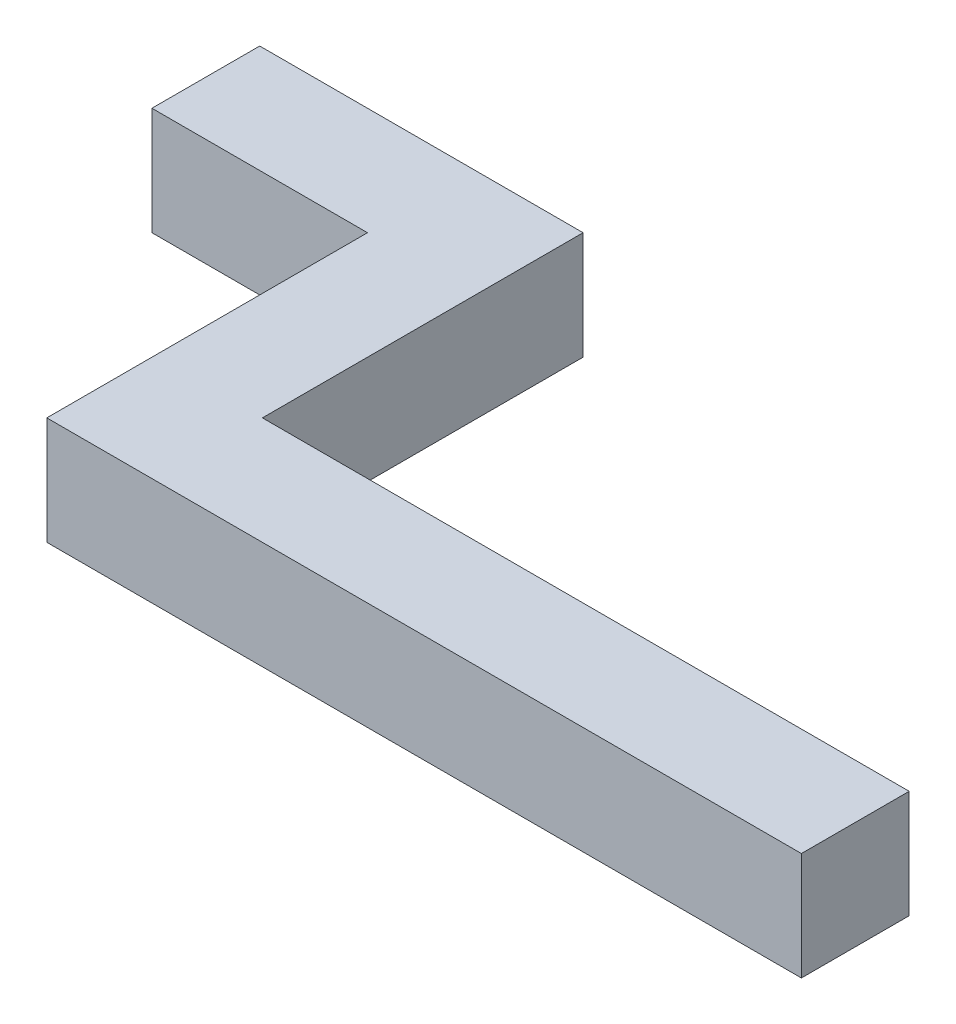
ISO-10303-21;
HEADER;
FILE_DESCRIPTION(('STEP AP214'),'2;1');
FILE_NAME('part.step','',(''),(''),'','','');
FILE_SCHEMA(('AUTOMOTIVE_DESIGN { 1 0 10303 214 1 1 1 1 }'));
ENDSEC;
DATA;
#1=APPLICATION_CONTEXT('core data for automotive mechanical design processes');
#2=APPLICATION_PROTOCOL_DEFINITION('international standard','automotive_design',2000,#1);
#3=PRODUCT_CONTEXT('',#1,'mechanical');
#4=PRODUCT('Part','Part','',(#3));
#5=PRODUCT_RELATED_PRODUCT_CATEGORY('part','',(#4));
#6=PRODUCT_DEFINITION_FORMATION('','',#4);
#7=PRODUCT_DEFINITION_CONTEXT('part definition',#1,'design');
#8=PRODUCT_DEFINITION('design','',#6,#7);
#9=PRODUCT_DEFINITION_SHAPE('','',#8);
#10=(LENGTH_UNIT() NAMED_UNIT(*) SI_UNIT(.MILLI.,.METRE.));
#11=(NAMED_UNIT(*) PLANE_ANGLE_UNIT() SI_UNIT($,.RADIAN.));
#12=(NAMED_UNIT(*) SI_UNIT($,.STERADIAN.) SOLID_ANGLE_UNIT());
#13=UNCERTAINTY_MEASURE_WITH_UNIT(LENGTH_MEASURE(1.E-05),#10,'distance_accuracy_value','');
#14=(GEOMETRIC_REPRESENTATION_CONTEXT(3) GLOBAL_UNCERTAINTY_ASSIGNED_CONTEXT((#13)) GLOBAL_UNIT_ASSIGNED_CONTEXT((#10,
#11,#12)) REPRESENTATION_CONTEXT('',''));
#15=CARTESIAN_POINT('',(0.,0.,0.));
#16=DIRECTION('',(0.,0.,1.));
#17=DIRECTION('',(1.,0.,0.));
#18=AXIS2_PLACEMENT_3D('',#15,#16,#17);
#19=CARTESIAN_POINT('',(0.,20.,0.));
#20=DIRECTION('',(1.,0.,0.));
#21=DIRECTION('',(0.,0.,-1.));
#22=AXIS2_PLACEMENT_3D('',#19,#20,#21);
#23=PLANE('',#22);
#24=DIRECTION('',(0.,0.,1.));
#25=VECTOR('',#24,1.);
#26=CARTESIAN_POINT('',(0.,0.,0.));
#27=LINE('',#26,#25);
#28=CARTESIAN_POINT('',(0.,0.,0.));
#29=VERTEX_POINT('',#28);
#30=CARTESIAN_POINT('',(0.,0.,20.));
#31=VERTEX_POINT('',#30);
#32=EDGE_CURVE('E140',#29,#31,#27,.T.);
#33=ORIENTED_EDGE('',*,*,#32,.T.);
#34=DIRECTION('',(0.,-1.,0.));
#35=VECTOR('',#34,1.);
#36=CARTESIAN_POINT('',(0.,20.,20.));
#37=LINE('',#36,#35);
#38=CARTESIAN_POINT('',(0.,20.,20.));
#39=VERTEX_POINT('',#38);
#40=EDGE_CURVE('E11',#39,#31,#37,.T.);
#41=ORIENTED_EDGE('',*,*,#40,.F.);
#42=DIRECTION('',(0.,0.,1.));
#43=VECTOR('',#42,1.);
#44=CARTESIAN_POINT('',(0.,20.,0.));
#45=LINE('',#44,#43);
#46=CARTESIAN_POINT('',(0.,20.,0.));
#47=VERTEX_POINT('',#46);
#48=EDGE_CURVE('E163',#47,#39,#45,.T.);
#49=ORIENTED_EDGE('',*,*,#48,.F.);
#50=DIRECTION('',(0.,-1.,0.));
#51=VECTOR('',#50,1.);
#52=CARTESIAN_POINT('',(0.,20.,0.));
#53=LINE('',#52,#51);
#54=EDGE_CURVE('E136',#47,#29,#53,.T.);
#55=ORIENTED_EDGE('',*,*,#54,.T.);
#56=EDGE_LOOP('',(#33,#41,#49,#55));
#57=FACE_BOUND('',#56,.T.);
#58=ADVANCED_FACE('F39',(#57),#23,.F.);
#59=CARTESIAN_POINT('',(0.,20.,20.));
#60=DIRECTION('',(0.,0.,-1.));
#61=DIRECTION('',(-1.,0.,0.));
#62=AXIS2_PLACEMENT_3D('',#59,#60,#61);
#63=PLANE('',#62);
#64=DIRECTION('',(1.,0.,0.));
#65=VECTOR('',#64,1.);
#66=CARTESIAN_POINT('',(0.,0.,20.));
#67=LINE('',#66,#65);
#68=CARTESIAN_POINT('',(40.,0.,20.));
#69=VERTEX_POINT('',#68);
#70=EDGE_CURVE('E144',#31,#69,#67,.T.);
#71=ORIENTED_EDGE('',*,*,#70,.T.);
#72=DIRECTION('',(0.,-1.,0.));
#73=VECTOR('',#72,1.);
#74=CARTESIAN_POINT('',(40.,20.,20.));
#75=LINE('',#74,#73);
#76=CARTESIAN_POINT('',(40.,20.,20.));
#77=VERTEX_POINT('',#76);
#78=EDGE_CURVE('E48',#77,#69,#75,.T.);
#79=ORIENTED_EDGE('',*,*,#78,.F.);
#80=DIRECTION('',(1.,0.,0.));
#81=VECTOR('',#80,1.);
#82=CARTESIAN_POINT('',(0.,20.,20.));
#83=LINE('',#82,#81);
#84=EDGE_CURVE('E99',#39,#77,#83,.T.);
#85=ORIENTED_EDGE('',*,*,#84,.F.);
#86=ORIENTED_EDGE('',*,*,#40,.T.);
#87=EDGE_LOOP('',(#71,#79,#85,#86));
#88=FACE_BOUND('',#87,.T.);
#89=ADVANCED_FACE('F208',(#88),#63,.F.);
#90=CARTESIAN_POINT('',(40.,20.,20.));
#91=DIRECTION('',(1.,0.,0.));
#92=DIRECTION('',(0.,0.,-1.));
#93=AXIS2_PLACEMENT_3D('',#90,#91,#92);
#94=PLANE('',#93);
#95=DIRECTION('',(0.,0.,1.));
#96=VECTOR('',#95,1.);
#97=CARTESIAN_POINT('',(40.,0.,20.));
#98=LINE('',#97,#96);
#99=CARTESIAN_POINT('',(40.,0.,79.5));
#100=VERTEX_POINT('',#99);
#101=EDGE_CURVE('E147',#69,#100,#98,.T.);
#102=ORIENTED_EDGE('',*,*,#101,.T.);
#103=DIRECTION('',(0.,-1.,0.));
#104=VECTOR('',#103,1.);
#105=CARTESIAN_POINT('',(40.,20.,79.5));
#106=LINE('',#105,#104);
#107=CARTESIAN_POINT('',(40.,20.,79.5));
#108=VERTEX_POINT('',#107);
#109=EDGE_CURVE('E174',#108,#100,#106,.T.);
#110=ORIENTED_EDGE('',*,*,#109,.F.);
#111=DIRECTION('',(0.,0.,1.));
#112=VECTOR('',#111,1.);
#113=CARTESIAN_POINT('',(40.,20.,20.));
#114=LINE('',#113,#112);
#115=EDGE_CURVE('E184',#77,#108,#114,.T.);
#116=ORIENTED_EDGE('',*,*,#115,.F.);
#117=ORIENTED_EDGE('',*,*,#78,.T.);
#118=EDGE_LOOP('',(#102,#110,#116,#117));
#119=FACE_BOUND('',#118,.T.);
#120=ADVANCED_FACE('F182',(#119),#94,.F.);
#121=CARTESIAN_POINT('',(126.937455237789,20.,79.5));
#122=DIRECTION('',(0.,0.,-1.));
#123=DIRECTION('',(-1.,0.,0.));
#124=AXIS2_PLACEMENT_3D('',#121,#122,#123);
#125=PLANE('',#124);
#126=DIRECTION('',(1.,0.,0.));
#127=VECTOR('',#126,1.);
#128=CARTESIAN_POINT('',(126.937455237789,0.,79.5));
#129=LINE('',#128,#127);
#130=CARTESIAN_POINT('',(180.,0.,79.5));
#131=VERTEX_POINT('',#130);
#132=EDGE_CURVE('E151',#100,#131,#129,.T.);
#133=ORIENTED_EDGE('',*,*,#132,.T.);
#134=DIRECTION('',(0.,-1.,0.));
#135=VECTOR('',#134,1.);
#136=CARTESIAN_POINT('',(180.,20.,79.5));
#137=LINE('',#136,#135);
#138=CARTESIAN_POINT('',(180.,20.,79.5));
#139=VERTEX_POINT('',#138);
#140=EDGE_CURVE('E170',#139,#131,#137,.T.);
#141=ORIENTED_EDGE('',*,*,#140,.F.);
#142=DIRECTION('',(1.,0.,0.));
#143=VECTOR('',#142,1.);
#144=CARTESIAN_POINT('',(40.,20.,79.5));
#145=LINE('',#144,#143);
#146=EDGE_CURVE('E196',#108,#139,#145,.T.);
#147=ORIENTED_EDGE('',*,*,#146,.F.);
#148=ORIENTED_EDGE('',*,*,#109,.T.);
#149=EDGE_LOOP('',(#133,#141,#147,#148));
#150=FACE_BOUND('',#149,.T.);
#151=ADVANCED_FACE('F191',(#150),#125,.F.);
#152=CARTESIAN_POINT('',(180.,20.,79.5));
#153=DIRECTION('',(-1.,0.,0.));
#154=DIRECTION('',(0.,0.,1.));
#155=AXIS2_PLACEMENT_3D('',#152,#153,#154);
#156=PLANE('',#155);
#157=DIRECTION('',(0.,0.,-1.));
#158=VECTOR('',#157,1.);
#159=CARTESIAN_POINT('',(180.,0.,79.5));
#160=LINE('',#159,#158);
#161=CARTESIAN_POINT('',(180.,0.,59.5));
#162=VERTEX_POINT('',#161);
#163=EDGE_CURVE('E154',#131,#162,#160,.T.);
#164=ORIENTED_EDGE('',*,*,#163,.T.);
#165=DIRECTION('',(0.,-1.,0.));
#166=VECTOR('',#165,1.);
#167=CARTESIAN_POINT('',(180.,20.,59.5));
#168=LINE('',#167,#166);
#169=CARTESIAN_POINT('',(180.,20.,59.5));
#170=VERTEX_POINT('',#169);
#171=EDGE_CURVE('E129',#170,#162,#168,.T.);
#172=ORIENTED_EDGE('',*,*,#171,.F.);
#173=DIRECTION('',(0.,0.,-1.));
#174=VECTOR('',#173,1.);
#175=CARTESIAN_POINT('',(180.,20.,79.5));
#176=LINE('',#175,#174);
#177=EDGE_CURVE('E118',#139,#170,#176,.T.);
#178=ORIENTED_EDGE('',*,*,#177,.F.);
#179=ORIENTED_EDGE('',*,*,#140,.T.);
#180=EDGE_LOOP('',(#164,#172,#178,#179));
#181=FACE_BOUND('',#180,.T.);
#182=ADVANCED_FACE('F194',(#181),#156,.F.);
#183=CARTESIAN_POINT('',(60.,20.,59.5));
#184=DIRECTION('',(0.,0.,1.));
#185=DIRECTION('',(1.,0.,0.));
#186=AXIS2_PLACEMENT_3D('',#183,#184,#185);
#187=PLANE('',#186);
#188=DIRECTION('',(-1.,0.,0.));
#189=VECTOR('',#188,1.);
#190=CARTESIAN_POINT('',(60.,0.,59.5));
#191=LINE('',#190,#189);
#192=CARTESIAN_POINT('',(60.,0.,59.5));
#193=VERTEX_POINT('',#192);
#194=EDGE_CURVE('E127',#162,#193,#191,.T.);
#195=ORIENTED_EDGE('',*,*,#194,.T.);
#196=DIRECTION('',(0.,-1.,0.));
#197=VECTOR('',#196,1.);
#198=CARTESIAN_POINT('',(60.,20.,59.5));
#199=LINE('',#198,#197);
#200=CARTESIAN_POINT('',(60.,20.,59.5));
#201=VERTEX_POINT('',#200);
#202=EDGE_CURVE('E124',#201,#193,#199,.T.);
#203=ORIENTED_EDGE('',*,*,#202,.F.);
#204=DIRECTION('',(-1.,0.,0.));
#205=VECTOR('',#204,1.);
#206=CARTESIAN_POINT('',(60.,20.,59.5));
#207=LINE('',#206,#205);
#208=EDGE_CURVE('E112',#170,#201,#207,.T.);
#209=ORIENTED_EDGE('',*,*,#208,.F.);
#210=ORIENTED_EDGE('',*,*,#171,.T.);
#211=EDGE_LOOP('',(#195,#203,#209,#210));
#212=FACE_BOUND('',#211,.T.);
#213=ADVANCED_FACE('F125',(#212),#187,.F.);
#214=CARTESIAN_POINT('',(60.,20.,0.));
#215=DIRECTION('',(-1.,0.,0.));
#216=DIRECTION('',(0.,0.,1.));
#217=AXIS2_PLACEMENT_3D('',#214,#215,#216);
#218=PLANE('',#217);
#219=DIRECTION('',(0.,0.,-1.));
#220=VECTOR('',#219,1.);
#221=CARTESIAN_POINT('',(60.,0.,0.));
#222=LINE('',#221,#220);
#223=CARTESIAN_POINT('',(60.,0.,0.));
#224=VERTEX_POINT('',#223);
#225=EDGE_CURVE('E85',#193,#224,#222,.T.);
#226=ORIENTED_EDGE('',*,*,#225,.T.);
#227=DIRECTION('',(0.,-1.,0.));
#228=VECTOR('',#227,1.);
#229=CARTESIAN_POINT('',(60.,20.,0.));
#230=LINE('',#229,#228);
#231=CARTESIAN_POINT('',(60.,20.,0.));
#232=VERTEX_POINT('',#231);
#233=EDGE_CURVE('E130',#232,#224,#230,.T.);
#234=ORIENTED_EDGE('',*,*,#233,.F.);
#235=DIRECTION('',(0.,0.,-1.));
#236=VECTOR('',#235,1.);
#237=CARTESIAN_POINT('',(60.,20.,0.));
#238=LINE('',#237,#236);
#239=EDGE_CURVE('E116',#201,#232,#238,.T.);
#240=ORIENTED_EDGE('',*,*,#239,.F.);
#241=ORIENTED_EDGE('',*,*,#202,.T.);
#242=EDGE_LOOP('',(#226,#234,#240,#241));
#243=FACE_BOUND('',#242,.T.);
#244=ADVANCED_FACE('F132',(#243),#218,.F.);
#245=CARTESIAN_POINT('',(0.,20.,0.));
#246=DIRECTION('',(0.,0.,1.));
#247=DIRECTION('',(1.,0.,0.));
#248=AXIS2_PLACEMENT_3D('',#245,#246,#247);
#249=PLANE('',#248);
#250=DIRECTION('',(-1.,0.,0.));
#251=VECTOR('',#250,1.);
#252=CARTESIAN_POINT('',(0.,0.,0.));
#253=LINE('',#252,#251);
#254=EDGE_CURVE('E91',#224,#29,#253,.T.);
#255=ORIENTED_EDGE('',*,*,#254,.T.);
#256=ORIENTED_EDGE('',*,*,#54,.F.);
#257=DIRECTION('',(-1.,0.,0.));
#258=VECTOR('',#257,1.);
#259=CARTESIAN_POINT('',(0.,20.,0.));
#260=LINE('',#259,#258);
#261=EDGE_CURVE('E56',#232,#47,#260,.T.);
#262=ORIENTED_EDGE('',*,*,#261,.F.);
#263=ORIENTED_EDGE('',*,*,#233,.T.);
#264=EDGE_LOOP('',(#255,#256,#262,#263));
#265=FACE_BOUND('',#264,.T.);
#266=ADVANCED_FACE('F224',(#265),#249,.F.);
#267=CARTESIAN_POINT('',(0.,20.,0.));
#268=DIRECTION('',(0.,1.,0.));
#269=DIRECTION('',(0.,0.,1.));
#270=AXIS2_PLACEMENT_3D('',#267,#268,#269);
#271=PLANE('',#270);
#272=ORIENTED_EDGE('',*,*,#48,.T.);
#273=ORIENTED_EDGE('',*,*,#84,.T.);
#274=ORIENTED_EDGE('',*,*,#115,.T.);
#275=ORIENTED_EDGE('',*,*,#146,.T.);
#276=ORIENTED_EDGE('',*,*,#177,.T.);
#277=ORIENTED_EDGE('',*,*,#208,.T.);
#278=ORIENTED_EDGE('',*,*,#239,.T.);
#279=ORIENTED_EDGE('',*,*,#261,.T.);
#280=EDGE_LOOP('',(#272,#273,#274,#275,#276,#277,#278,#279));
#281=FACE_BOUND('',#280,.T.);
#282=ADVANCED_FACE('F114',(#281),#271,.T.);
#283=CARTESIAN_POINT('',(0.,0.,0.));
#284=DIRECTION('',(0.,1.,0.));
#285=DIRECTION('',(0.,0.,1.));
#286=AXIS2_PLACEMENT_3D('',#283,#284,#285);
#287=PLANE('',#286);
#288=ORIENTED_EDGE('',*,*,#32,.F.);
#289=ORIENTED_EDGE('',*,*,#254,.F.);
#290=ORIENTED_EDGE('',*,*,#225,.F.);
#291=ORIENTED_EDGE('',*,*,#194,.F.);
#292=ORIENTED_EDGE('',*,*,#163,.F.);
#293=ORIENTED_EDGE('',*,*,#132,.F.);
#294=ORIENTED_EDGE('',*,*,#101,.F.);
#295=ORIENTED_EDGE('',*,*,#70,.F.);
#296=EDGE_LOOP('',(#288,#289,#290,#291,#292,#293,#294,#295));
#297=FACE_BOUND('',#296,.T.);
#298=ADVANCED_FACE('F187',(#297),#287,.F.);
#299=CLOSED_SHELL('',(#58,#89,#120,#151,#182,#213,#244,#266,#282,#298));
#300=MANIFOLD_SOLID_BREP('B2',#299);
#301=ADVANCED_BREP_SHAPE_REPRESENTATION('',(#18,#300),#14);
#302=SHAPE_DEFINITION_REPRESENTATION(#9,#301);
ENDSEC;
END-ISO-10303-21;
